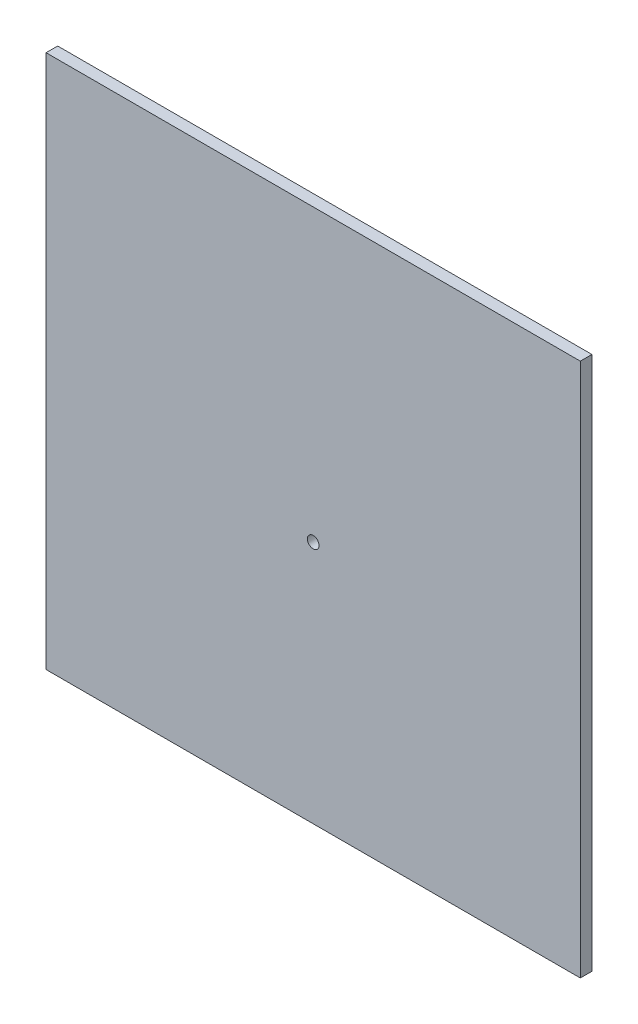
ISO-10303-21;
HEADER;
FILE_DESCRIPTION(('STEP AP214'),'2;1');
FILE_NAME('part.step','',(''),(''),'','','');
FILE_SCHEMA(('AUTOMOTIVE_DESIGN { 1 0 10303 214 1 1 1 1 }'));
ENDSEC;
DATA;
#1=APPLICATION_CONTEXT('core data for automotive mechanical design processes');
#2=APPLICATION_PROTOCOL_DEFINITION('international standard','automotive_design',2000,#1);
#3=PRODUCT_CONTEXT('',#1,'mechanical');
#4=PRODUCT('Part','Part','',(#3));
#5=PRODUCT_RELATED_PRODUCT_CATEGORY('part','',(#4));
#6=PRODUCT_DEFINITION_FORMATION('','',#4);
#7=PRODUCT_DEFINITION_CONTEXT('part definition',#1,'design');
#8=PRODUCT_DEFINITION('design','',#6,#7);
#9=PRODUCT_DEFINITION_SHAPE('','',#8);
#10=(LENGTH_UNIT() NAMED_UNIT(*) SI_UNIT(.MILLI.,.METRE.));
#11=(NAMED_UNIT(*) PLANE_ANGLE_UNIT() SI_UNIT($,.RADIAN.));
#12=(NAMED_UNIT(*) SI_UNIT($,.STERADIAN.) SOLID_ANGLE_UNIT());
#13=UNCERTAINTY_MEASURE_WITH_UNIT(LENGTH_MEASURE(1.E-05),#10,'distance_accuracy_value','');
#14=(GEOMETRIC_REPRESENTATION_CONTEXT(3) GLOBAL_UNCERTAINTY_ASSIGNED_CONTEXT((#13)) GLOBAL_UNIT_ASSIGNED_CONTEXT((#10,
#11,#12)) REPRESENTATION_CONTEXT('',''));
#15=CARTESIAN_POINT('',(0.,0.,0.));
#16=DIRECTION('',(0.,0.,1.));
#17=DIRECTION('',(1.,0.,0.));
#18=AXIS2_PLACEMENT_3D('',#15,#16,#17);
#19=CARTESIAN_POINT('',(0.,0.,12.7));
#20=DIRECTION('',(0.,0.,-1.));
#21=DIRECTION('',(-1.,0.,0.));
#22=AXIS2_PLACEMENT_3D('',#19,#20,#21);
#23=PLANE('',#22);
#24=DIRECTION('',(0.,-1.,0.));
#25=VECTOR('',#24,1.);
#26=CARTESIAN_POINT('',(0.,0.,12.7));
#27=LINE('',#26,#25);
#28=CARTESIAN_POINT('',(0.,584.2,12.7));
#29=VERTEX_POINT('',#28);
#30=CARTESIAN_POINT('',(0.,0.,12.7));
#31=VERTEX_POINT('',#30);
#32=EDGE_CURVE('E87',#29,#31,#27,.T.);
#33=ORIENTED_EDGE('',*,*,#32,.T.);
#34=DIRECTION('',(1.,0.,0.));
#35=VECTOR('',#34,1.);
#36=CARTESIAN_POINT('',(0.,0.,12.7));
#37=LINE('',#36,#35);
#38=CARTESIAN_POINT('',(584.2,0.,12.7));
#39=VERTEX_POINT('',#38);
#40=EDGE_CURVE('E82',#31,#39,#37,.T.);
#41=ORIENTED_EDGE('',*,*,#40,.T.);
#42=DIRECTION('',(0.,1.,0.));
#43=VECTOR('',#42,1.);
#44=CARTESIAN_POINT('',(584.2,0.,12.7));
#45=LINE('',#44,#43);
#46=CARTESIAN_POINT('',(584.2,584.2,12.7));
#47=VERTEX_POINT('',#46);
#48=EDGE_CURVE('E85',#39,#47,#45,.T.);
#49=ORIENTED_EDGE('',*,*,#48,.T.);
#50=DIRECTION('',(-1.,0.,0.));
#51=VECTOR('',#50,1.);
#52=CARTESIAN_POINT('',(0.,584.2,12.7));
#53=LINE('',#52,#51);
#54=EDGE_CURVE('E52',#47,#29,#53,.T.);
#55=ORIENTED_EDGE('',*,*,#54,.T.);
#56=EDGE_LOOP('',(#33,#41,#49,#55));
#57=FACE_BOUND('',#56,.T.);
#58=CARTESIAN_POINT('',(292.1,266.7,12.7));
#59=DIRECTION('',(0.,0.,1.));
#60=DIRECTION('',(1.,0.,0.));
#61=AXIS2_PLACEMENT_3D('',#58,#59,#60);
#62=CIRCLE('',#61,6.34999999999999);
#63=CARTESIAN_POINT('',(298.45,266.7,12.7));
#64=VERTEX_POINT('',#63);
#65=EDGE_CURVE('E102',#64,#64,#62,.T.);
#66=ORIENTED_EDGE('',*,*,#65,.F.);
#67=EDGE_LOOP('',(#66));
#68=FACE_BOUND('',#67,.T.);
#69=ADVANCED_FACE('F35',(#57,#68),#23,.F.);
#70=CARTESIAN_POINT('',(0.,0.,0.));
#71=DIRECTION('',(0.,0.,-1.));
#72=DIRECTION('',(-1.,0.,0.));
#73=AXIS2_PLACEMENT_3D('',#70,#71,#72);
#74=PLANE('',#73);
#75=DIRECTION('',(0.,-1.,0.));
#76=VECTOR('',#75,1.);
#77=CARTESIAN_POINT('',(0.,0.,0.));
#78=LINE('',#77,#76);
#79=CARTESIAN_POINT('',(0.,584.2,0.));
#80=VERTEX_POINT('',#79);
#81=CARTESIAN_POINT('',(0.,0.,0.));
#82=VERTEX_POINT('',#81);
#83=EDGE_CURVE('E99',#80,#82,#78,.T.);
#84=ORIENTED_EDGE('',*,*,#83,.F.);
#85=DIRECTION('',(-1.,0.,0.));
#86=VECTOR('',#85,1.);
#87=CARTESIAN_POINT('',(0.,584.2,0.));
#88=LINE('',#87,#86);
#89=CARTESIAN_POINT('',(584.2,584.2,0.));
#90=VERTEX_POINT('',#89);
#91=EDGE_CURVE('E75',#90,#80,#88,.T.);
#92=ORIENTED_EDGE('',*,*,#91,.F.);
#93=DIRECTION('',(0.,1.,0.));
#94=VECTOR('',#93,1.);
#95=CARTESIAN_POINT('',(584.2,0.,0.));
#96=LINE('',#95,#94);
#97=CARTESIAN_POINT('',(584.2,0.,0.));
#98=VERTEX_POINT('',#97);
#99=EDGE_CURVE('E69',#98,#90,#96,.T.);
#100=ORIENTED_EDGE('',*,*,#99,.F.);
#101=DIRECTION('',(1.,0.,0.));
#102=VECTOR('',#101,1.);
#103=CARTESIAN_POINT('',(0.,0.,0.));
#104=LINE('',#103,#102);
#105=EDGE_CURVE('E91',#82,#98,#104,.T.);
#106=ORIENTED_EDGE('',*,*,#105,.F.);
#107=EDGE_LOOP('',(#84,#92,#100,#106));
#108=FACE_BOUND('',#107,.T.);
#109=CARTESIAN_POINT('',(292.1,266.7,0.));
#110=DIRECTION('',(0.,0.,1.));
#111=DIRECTION('',(1.,0.,0.));
#112=AXIS2_PLACEMENT_3D('',#109,#110,#111);
#113=CIRCLE('',#112,6.34999999999999);
#114=CARTESIAN_POINT('',(298.45,266.7,0.));
#115=VERTEX_POINT('',#114);
#116=EDGE_CURVE('E114',#115,#115,#113,.T.);
#117=ORIENTED_EDGE('',*,*,#116,.T.);
#118=EDGE_LOOP('',(#117));
#119=FACE_BOUND('',#118,.T.);
#120=ADVANCED_FACE('F110',(#108,#119),#74,.T.);
#121=CARTESIAN_POINT('',(0.,0.,12.7));
#122=DIRECTION('',(1.,0.,0.));
#123=DIRECTION('',(0.,0.,-1.));
#124=AXIS2_PLACEMENT_3D('',#121,#122,#123);
#125=PLANE('',#124);
#126=ORIENTED_EDGE('',*,*,#83,.T.);
#127=DIRECTION('',(0.,0.,-1.));
#128=VECTOR('',#127,1.);
#129=CARTESIAN_POINT('',(0.,0.,12.7));
#130=LINE('',#129,#128);
#131=EDGE_CURVE('E11',#31,#82,#130,.T.);
#132=ORIENTED_EDGE('',*,*,#131,.F.);
#133=ORIENTED_EDGE('',*,*,#32,.F.);
#134=DIRECTION('',(0.,0.,-1.));
#135=VECTOR('',#134,1.);
#136=CARTESIAN_POINT('',(0.,584.2,12.7));
#137=LINE('',#136,#135);
#138=EDGE_CURVE('E95',#29,#80,#137,.T.);
#139=ORIENTED_EDGE('',*,*,#138,.T.);
#140=EDGE_LOOP('',(#126,#132,#133,#139));
#141=FACE_BOUND('',#140,.T.);
#142=ADVANCED_FACE('F37',(#141),#125,.F.);
#143=CARTESIAN_POINT('',(0.,0.,12.7));
#144=DIRECTION('',(0.,1.,0.));
#145=DIRECTION('',(0.,0.,1.));
#146=AXIS2_PLACEMENT_3D('',#143,#144,#145);
#147=PLANE('',#146);
#148=ORIENTED_EDGE('',*,*,#105,.T.);
#149=DIRECTION('',(0.,0.,-1.));
#150=VECTOR('',#149,1.);
#151=CARTESIAN_POINT('',(584.2,0.,12.7));
#152=LINE('',#151,#150);
#153=EDGE_CURVE('E44',#39,#98,#152,.T.);
#154=ORIENTED_EDGE('',*,*,#153,.F.);
#155=ORIENTED_EDGE('',*,*,#40,.F.);
#156=ORIENTED_EDGE('',*,*,#131,.T.);
#157=EDGE_LOOP('',(#148,#154,#155,#156));
#158=FACE_BOUND('',#157,.T.);
#159=ADVANCED_FACE('F90',(#158),#147,.F.);
#160=CARTESIAN_POINT('',(584.2,0.,12.7));
#161=DIRECTION('',(-1.,0.,0.));
#162=DIRECTION('',(0.,0.,1.));
#163=AXIS2_PLACEMENT_3D('',#160,#161,#162);
#164=PLANE('',#163);
#165=ORIENTED_EDGE('',*,*,#99,.T.);
#166=DIRECTION('',(0.,0.,-1.));
#167=VECTOR('',#166,1.);
#168=CARTESIAN_POINT('',(584.2,584.2,12.7));
#169=LINE('',#168,#167);
#170=EDGE_CURVE('E92',#47,#90,#169,.T.);
#171=ORIENTED_EDGE('',*,*,#170,.F.);
#172=ORIENTED_EDGE('',*,*,#48,.F.);
#173=ORIENTED_EDGE('',*,*,#153,.T.);
#174=EDGE_LOOP('',(#165,#171,#172,#173));
#175=FACE_BOUND('',#174,.T.);
#176=ADVANCED_FACE('F93',(#175),#164,.F.);
#177=CARTESIAN_POINT('',(0.,584.2,12.7));
#178=DIRECTION('',(0.,-1.,0.));
#179=DIRECTION('',(0.,0.,-1.));
#180=AXIS2_PLACEMENT_3D('',#177,#178,#179);
#181=PLANE('',#180);
#182=ORIENTED_EDGE('',*,*,#91,.T.);
#183=ORIENTED_EDGE('',*,*,#138,.F.);
#184=ORIENTED_EDGE('',*,*,#54,.F.);
#185=ORIENTED_EDGE('',*,*,#170,.T.);
#186=EDGE_LOOP('',(#182,#183,#184,#185));
#187=FACE_BOUND('',#186,.T.);
#188=ADVANCED_FACE('F107',(#187),#181,.F.);
#189=CARTESIAN_POINT('',(292.1,266.7,12.7));
#190=DIRECTION('',(0.,0.,-1.));
#191=DIRECTION('',(-1.,0.,0.));
#192=AXIS2_PLACEMENT_3D('',#189,#190,#191);
#193=CYLINDRICAL_SURFACE('',#192,6.34999999999999);
#194=ORIENTED_EDGE('',*,*,#65,.T.);
#195=EDGE_LOOP('',(#194));
#196=FACE_BOUND('',#195,.T.);
#197=ORIENTED_EDGE('',*,*,#116,.F.);
#198=EDGE_LOOP('',(#197));
#199=FACE_BOUND('',#198,.T.);
#200=ADVANCED_FACE('F120',(#196,#199),#193,.F.);
#201=CLOSED_SHELL('',(#69,#120,#142,#159,#176,#188,#200));
#202=MANIFOLD_SOLID_BREP('B2',#201);
#203=ADVANCED_BREP_SHAPE_REPRESENTATION('',(#18,#202),#14);
#204=SHAPE_DEFINITION_REPRESENTATION(#9,#203);
ENDSEC;
END-ISO-10303-21;
